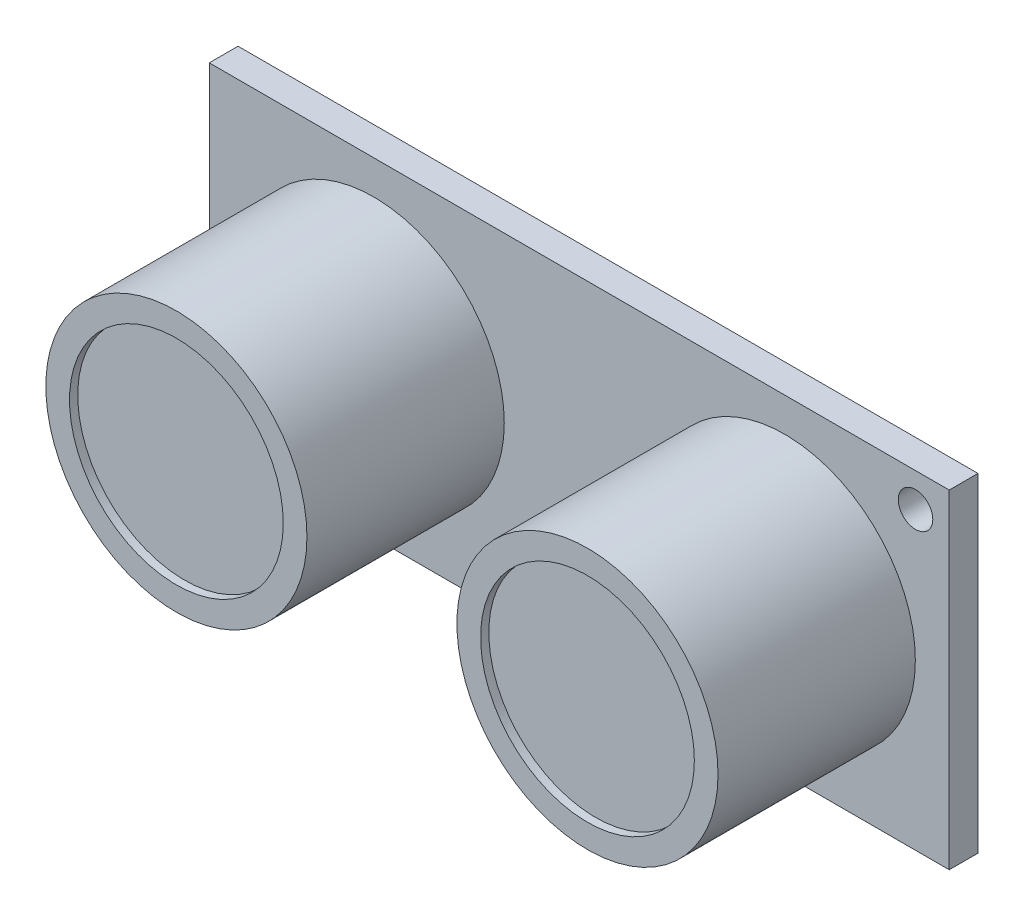
ISO-10303-21;
HEADER;
FILE_DESCRIPTION(('STEP AP214'),'2;1');
FILE_NAME('part.step','',(''),(''),'','','');
FILE_SCHEMA(('AUTOMOTIVE_DESIGN { 1 0 10303 214 1 1 1 1 }'));
ENDSEC;
DATA;
#1=APPLICATION_CONTEXT('core data for automotive mechanical design processes');
#2=APPLICATION_PROTOCOL_DEFINITION('international standard','automotive_design',2000,#1);
#3=PRODUCT_CONTEXT('',#1,'mechanical');
#4=PRODUCT('Part','Part','',(#3));
#5=PRODUCT_RELATED_PRODUCT_CATEGORY('part','',(#4));
#6=PRODUCT_DEFINITION_FORMATION('','',#4);
#7=PRODUCT_DEFINITION_CONTEXT('part definition',#1,'design');
#8=PRODUCT_DEFINITION('design','',#6,#7);
#9=PRODUCT_DEFINITION_SHAPE('','',#8);
#10=(LENGTH_UNIT() NAMED_UNIT(*) SI_UNIT(.MILLI.,.METRE.));
#11=(NAMED_UNIT(*) PLANE_ANGLE_UNIT() SI_UNIT($,.RADIAN.));
#12=(NAMED_UNIT(*) SI_UNIT($,.STERADIAN.) SOLID_ANGLE_UNIT());
#13=UNCERTAINTY_MEASURE_WITH_UNIT(LENGTH_MEASURE(1.E-05),#10,'distance_accuracy_value','');
#14=(GEOMETRIC_REPRESENTATION_CONTEXT(3) GLOBAL_UNCERTAINTY_ASSIGNED_CONTEXT((#13)) GLOBAL_UNIT_ASSIGNED_CONTEXT((#10,
#11,#12)) REPRESENTATION_CONTEXT('',''));
#15=CARTESIAN_POINT('',(0.,0.,0.));
#16=DIRECTION('',(0.,0.,1.));
#17=DIRECTION('',(1.,0.,0.));
#18=AXIS2_PLACEMENT_3D('',#15,#16,#17);
#19=CARTESIAN_POINT('',(0.,0.,0.));
#20=DIRECTION('',(0.,0.,1.));
#21=DIRECTION('',(1.,0.,0.));
#22=AXIS2_PLACEMENT_3D('',#19,#20,#21);
#23=PLANE('',#22);
#24=CARTESIAN_POINT('',(-17.6564034730701,23.4240062406729,0.));
#25=DIRECTION('',(0.,0.,1.));
#26=DIRECTION('',(1.,0.,0.));
#27=AXIS2_PLACEMENT_3D('',#24,#25,#26);
#28=CIRCLE('',#27,1.05);
#29=CARTESIAN_POINT('',(-16.6064034730701,23.4240062406729,0.));
#30=VERTEX_POINT('',#29);
#31=EDGE_CURVE('E198',#30,#30,#28,.T.);
#32=ORIENTED_EDGE('',*,*,#31,.T.);
#33=EDGE_LOOP('',(#32));
#34=FACE_BOUND('',#33,.T.);
#35=DIRECTION('',(0.,-1.,0.));
#36=VECTOR('',#35,1.);
#37=CARTESIAN_POINT('',(-60.6064034730701,25.4740062406729,0.));
#38=LINE('',#37,#36);
#39=CARTESIAN_POINT('',(-60.6064034730701,25.4740062406729,0.));
#40=VERTEX_POINT('',#39);
#41=CARTESIAN_POINT('',(-60.6064034730701,5.47400624067289,0.));
#42=VERTEX_POINT('',#41);
#43=EDGE_CURVE('E210',#40,#42,#38,.T.);
#44=ORIENTED_EDGE('',*,*,#43,.F.);
#45=DIRECTION('',(-1.,0.,0.));
#46=VECTOR('',#45,1.);
#47=CARTESIAN_POINT('',(-60.6064034730701,25.4740062406729,0.));
#48=LINE('',#47,#46);
#49=CARTESIAN_POINT('',(-15.6064034730701,25.4740062406729,0.));
#50=VERTEX_POINT('',#49);
#51=EDGE_CURVE('E217',#50,#40,#48,.T.);
#52=ORIENTED_EDGE('',*,*,#51,.F.);
#53=DIRECTION('',(0.,1.,0.));
#54=VECTOR('',#53,1.);
#55=CARTESIAN_POINT('',(-15.6064034730701,25.4740062406729,0.));
#56=LINE('',#55,#54);
#57=CARTESIAN_POINT('',(-15.6064034730701,5.47400624067289,0.));
#58=VERTEX_POINT('',#57);
#59=EDGE_CURVE('E228',#58,#50,#56,.T.);
#60=ORIENTED_EDGE('',*,*,#59,.F.);
#61=DIRECTION('',(1.,0.,0.));
#62=VECTOR('',#61,1.);
#63=CARTESIAN_POINT('',(-60.6064034730701,5.47400624067289,0.));
#64=LINE('',#63,#62);
#65=EDGE_CURVE('E226',#42,#58,#64,.T.);
#66=ORIENTED_EDGE('',*,*,#65,.F.);
#67=EDGE_LOOP('',(#44,#52,#60,#66));
#68=FACE_BOUND('',#67,.T.);
#69=CARTESIAN_POINT('',(-58.5564034730701,7.52400624067289,0.));
#70=DIRECTION('',(0.,0.,1.));
#71=DIRECTION('',(1.,0.,0.));
#72=AXIS2_PLACEMENT_3D('',#69,#70,#71);
#73=CIRCLE('',#72,1.05);
#74=CARTESIAN_POINT('',(-57.5064034730701,7.52400624067289,0.));
#75=VERTEX_POINT('',#74);
#76=EDGE_CURVE('E204',#75,#75,#73,.T.);
#77=ORIENTED_EDGE('',*,*,#76,.T.);
#78=EDGE_LOOP('',(#77));
#79=FACE_BOUND('',#78,.T.);
#80=DIRECTION('',(0.,-1.,0.));
#81=VECTOR('',#80,1.);
#82=CARTESIAN_POINT('',(-32.8933036925584,8.69490428219888,0.));
#83=LINE('',#82,#81);
#84=CARTESIAN_POINT('',(-32.8933036925584,8.69490428219888,0.));
#85=VERTEX_POINT('',#84);
#86=CARTESIAN_POINT('',(-32.8933036925584,5.87354584212114,0.));
#87=VERTEX_POINT('',#86);
#88=EDGE_CURVE('E124',#85,#87,#83,.T.);
#89=ORIENTED_EDGE('',*,*,#88,.F.);
#90=DIRECTION('',(1.,0.,0.));
#91=VECTOR('',#90,1.);
#92=CARTESIAN_POINT('',(-32.8933036925584,8.69490428219888,0.));
#93=LINE('',#92,#91);
#94=CARTESIAN_POINT('',(-42.7535151480879,8.69490428219888,0.));
#95=VERTEX_POINT('',#94);
#96=EDGE_CURVE('E121',#95,#85,#93,.T.);
#97=ORIENTED_EDGE('',*,*,#96,.F.);
#98=DIRECTION('',(0.,1.,0.));
#99=VECTOR('',#98,1.);
#100=CARTESIAN_POINT('',(-42.7535151480879,8.69490428219888,0.));
#101=LINE('',#100,#99);
#102=CARTESIAN_POINT('',(-42.7535151480879,5.87354584212114,0.));
#103=VERTEX_POINT('',#102);
#104=EDGE_CURVE('E58',#103,#95,#101,.T.);
#105=ORIENTED_EDGE('',*,*,#104,.F.);
#106=DIRECTION('',(-1.,0.,0.));
#107=VECTOR('',#106,1.);
#108=CARTESIAN_POINT('',(-32.8933036925584,5.87354584212114,0.));
#109=LINE('',#108,#107);
#110=EDGE_CURVE('E53',#87,#103,#109,.T.);
#111=ORIENTED_EDGE('',*,*,#110,.F.);
#112=EDGE_LOOP('',(#89,#97,#105,#111));
#113=FACE_BOUND('',#112,.T.);
#114=ADVANCED_FACE('F37',(#34,#68,#79,#113),#23,.F.);
#115=CARTESIAN_POINT('',(0.,0.,1.75));
#116=DIRECTION('',(0.,0.,1.));
#117=DIRECTION('',(1.,0.,0.));
#118=AXIS2_PLACEMENT_3D('',#115,#116,#117);
#119=PLANE('',#118);
#120=CARTESIAN_POINT('',(-36.5664034730701,7.37400624067289,1.75));
#121=DIRECTION('',(0.,0.,1.));
#122=DIRECTION('',(1.,0.,0.));
#123=AXIS2_PLACEMENT_3D('',#120,#121,#122);
#124=CIRCLE('',#123,0.320000000000004);
#125=CARTESIAN_POINT('',(-36.2464034730701,7.37400624067289,1.75));
#126=VERTEX_POINT('',#125);
#127=EDGE_CURVE('E155',#126,#126,#124,.F.);
#128=ORIENTED_EDGE('',*,*,#127,.T.);
#129=EDGE_LOOP('',(#128));
#130=FACE_BOUND('',#129,.T.);
#131=CARTESIAN_POINT('',(-41.6464034730701,7.37400624067289,1.75));
#132=DIRECTION('',(0.,0.,1.));
#133=DIRECTION('',(1.,0.,0.));
#134=AXIS2_PLACEMENT_3D('',#131,#132,#133);
#135=CIRCLE('',#134,0.320000000000004);
#136=CARTESIAN_POINT('',(-41.3264034730701,7.37400624067289,1.75));
#137=VERTEX_POINT('',#136);
#138=EDGE_CURVE('E173',#137,#137,#135,.F.);
#139=ORIENTED_EDGE('',*,*,#138,.T.);
#140=EDGE_LOOP('',(#139));
#141=FACE_BOUND('',#140,.T.);
#142=CARTESIAN_POINT('',(-50.6064034730701,15.4740062406729,1.75));
#143=DIRECTION('',(0.,0.,1.));
#144=DIRECTION('',(1.,0.,0.));
#145=AXIS2_PLACEMENT_3D('',#142,#143,#144);
#146=CIRCLE('',#145,7.94);
#147=CARTESIAN_POINT('',(-42.6664034730701,15.4740062406729,1.75));
#148=VERTEX_POINT('',#147);
#149=EDGE_CURVE('E192',#148,#148,#146,.T.);
#150=ORIENTED_EDGE('',*,*,#149,.F.);
#151=EDGE_LOOP('',(#150));
#152=FACE_BOUND('',#151,.T.);
#153=CARTESIAN_POINT('',(-58.5564034730701,7.52400624067289,1.75));
#154=DIRECTION('',(0.,0.,1.));
#155=DIRECTION('',(1.,0.,0.));
#156=AXIS2_PLACEMENT_3D('',#153,#154,#155);
#157=CIRCLE('',#156,1.05);
#158=CARTESIAN_POINT('',(-57.5064034730701,7.52400624067289,1.75));
#159=VERTEX_POINT('',#158);
#160=EDGE_CURVE('E207',#159,#159,#157,.T.);
#161=ORIENTED_EDGE('',*,*,#160,.F.);
#162=EDGE_LOOP('',(#161));
#163=FACE_BOUND('',#162,.T.);
#164=DIRECTION('',(0.,-1.,0.));
#165=VECTOR('',#164,1.);
#166=CARTESIAN_POINT('',(-60.6064034730701,25.4740062406729,1.75));
#167=LINE('',#166,#165);
#168=CARTESIAN_POINT('',(-60.6064034730701,25.4740062406729,1.75));
#169=VERTEX_POINT('',#168);
#170=CARTESIAN_POINT('',(-60.6064034730701,5.47400624067289,1.75));
#171=VERTEX_POINT('',#170);
#172=EDGE_CURVE('E213',#169,#171,#167,.T.);
#173=ORIENTED_EDGE('',*,*,#172,.T.);
#174=DIRECTION('',(1.,0.,0.));
#175=VECTOR('',#174,1.);
#176=CARTESIAN_POINT('',(-60.6064034730701,5.47400624067289,1.75));
#177=LINE('',#176,#175);
#178=CARTESIAN_POINT('',(-15.6064034730701,5.47400624067289,1.75));
#179=VERTEX_POINT('',#178);
#180=EDGE_CURVE('E216',#171,#179,#177,.T.);
#181=ORIENTED_EDGE('',*,*,#180,.T.);
#182=DIRECTION('',(0.,1.,0.));
#183=VECTOR('',#182,1.);
#184=CARTESIAN_POINT('',(-15.6064034730701,25.4740062406729,1.75));
#185=LINE('',#184,#183);
#186=CARTESIAN_POINT('',(-15.6064034730701,25.4740062406729,1.75));
#187=VERTEX_POINT('',#186);
#188=EDGE_CURVE('E219',#179,#187,#185,.T.);
#189=ORIENTED_EDGE('',*,*,#188,.T.);
#190=DIRECTION('',(-1.,0.,0.));
#191=VECTOR('',#190,1.);
#192=CARTESIAN_POINT('',(-60.6064034730701,25.4740062406729,1.75));
#193=LINE('',#192,#191);
#194=EDGE_CURVE('E221',#187,#169,#193,.T.);
#195=ORIENTED_EDGE('',*,*,#194,.T.);
#196=EDGE_LOOP('',(#173,#181,#189,#195));
#197=FACE_BOUND('',#196,.T.);
#198=CARTESIAN_POINT('',(-17.6564034730701,23.4240062406729,1.75));
#199=DIRECTION('',(0.,0.,1.));
#200=DIRECTION('',(1.,0.,0.));
#201=AXIS2_PLACEMENT_3D('',#198,#199,#200);
#202=CIRCLE('',#201,1.05);
#203=CARTESIAN_POINT('',(-16.6064034730701,23.4240062406729,1.75));
#204=VERTEX_POINT('',#203);
#205=EDGE_CURVE('E201',#204,#204,#202,.T.);
#206=ORIENTED_EDGE('',*,*,#205,.F.);
#207=EDGE_LOOP('',(#206));
#208=FACE_BOUND('',#207,.T.);
#209=CARTESIAN_POINT('',(-25.6064034730701,15.4740062406729,1.75));
#210=DIRECTION('',(0.,0.,1.));
#211=DIRECTION('',(1.,0.,0.));
#212=AXIS2_PLACEMENT_3D('',#209,#210,#211);
#213=CIRCLE('',#212,7.94);
#214=CARTESIAN_POINT('',(-17.6664034730701,15.4740062406729,1.75));
#215=VERTEX_POINT('',#214);
#216=EDGE_CURVE('E186',#215,#215,#213,.T.);
#217=ORIENTED_EDGE('',*,*,#216,.F.);
#218=EDGE_LOOP('',(#217));
#219=FACE_BOUND('',#218,.T.);
#220=CARTESIAN_POINT('',(-39.1064034730701,7.37400624067289,1.75));
#221=DIRECTION('',(0.,0.,1.));
#222=DIRECTION('',(1.,0.,0.));
#223=AXIS2_PLACEMENT_3D('',#220,#221,#222);
#224=CIRCLE('',#223,0.320000000000004);
#225=CARTESIAN_POINT('',(-38.7864034730701,7.37400624067289,1.75));
#226=VERTEX_POINT('',#225);
#227=EDGE_CURVE('E164',#226,#226,#224,.F.);
#228=ORIENTED_EDGE('',*,*,#227,.T.);
#229=EDGE_LOOP('',(#228));
#230=FACE_BOUND('',#229,.T.);
#231=CARTESIAN_POINT('',(-34.0264034730701,7.37400624067289,1.75));
#232=DIRECTION('',(0.,0.,1.));
#233=DIRECTION('',(1.,0.,0.));
#234=AXIS2_PLACEMENT_3D('',#231,#232,#233);
#235=CIRCLE('',#234,0.320000000000004);
#236=CARTESIAN_POINT('',(-33.7064034730701,7.37400624067289,1.75));
#237=VERTEX_POINT('',#236);
#238=EDGE_CURVE('E146',#237,#237,#235,.F.);
#239=ORIENTED_EDGE('',*,*,#238,.T.);
#240=EDGE_LOOP('',(#239));
#241=FACE_BOUND('',#240,.T.);
#242=ADVANCED_FACE('F280',(#130,#141,#152,#163,#197,#208,#219,#230,#241),#119,.T.);
#243=CARTESIAN_POINT('',(-60.6064034730701,25.4740062406729,1.75));
#244=DIRECTION('',(1.,0.,0.));
#245=DIRECTION('',(0.,0.,-1.));
#246=AXIS2_PLACEMENT_3D('',#243,#244,#245);
#247=PLANE('',#246);
#248=ORIENTED_EDGE('',*,*,#43,.T.);
#249=DIRECTION('',(0.,0.,-1.));
#250=VECTOR('',#249,1.);
#251=CARTESIAN_POINT('',(-60.6064034730701,5.47400624067289,1.75));
#252=LINE('',#251,#250);
#253=EDGE_CURVE('E239',#171,#42,#252,.T.);
#254=ORIENTED_EDGE('',*,*,#253,.F.);
#255=ORIENTED_EDGE('',*,*,#172,.F.);
#256=DIRECTION('',(0.,0.,-1.));
#257=VECTOR('',#256,1.);
#258=CARTESIAN_POINT('',(-60.6064034730701,25.4740062406729,1.75));
#259=LINE('',#258,#257);
#260=EDGE_CURVE('E223',#169,#40,#259,.T.);
#261=ORIENTED_EDGE('',*,*,#260,.T.);
#262=EDGE_LOOP('',(#248,#254,#255,#261));
#263=FACE_BOUND('',#262,.T.);
#264=ADVANCED_FACE('F286',(#263),#247,.F.);
#265=CARTESIAN_POINT('',(-60.6064034730701,5.47400624067289,1.75));
#266=DIRECTION('',(0.,1.,0.));
#267=DIRECTION('',(0.,0.,1.));
#268=AXIS2_PLACEMENT_3D('',#265,#266,#267);
#269=PLANE('',#268);
#270=ORIENTED_EDGE('',*,*,#65,.T.);
#271=DIRECTION('',(0.,0.,-1.));
#272=VECTOR('',#271,1.);
#273=CARTESIAN_POINT('',(-15.6064034730701,5.47400624067289,1.75));
#274=LINE('',#273,#272);
#275=EDGE_CURVE('E236',#179,#58,#274,.T.);
#276=ORIENTED_EDGE('',*,*,#275,.F.);
#277=ORIENTED_EDGE('',*,*,#180,.F.);
#278=ORIENTED_EDGE('',*,*,#253,.T.);
#279=EDGE_LOOP('',(#270,#276,#277,#278));
#280=FACE_BOUND('',#279,.T.);
#281=ADVANCED_FACE('F300',(#280),#269,.F.);
#282=CARTESIAN_POINT('',(-15.6064034730701,25.4740062406729,1.75));
#283=DIRECTION('',(-1.,0.,0.));
#284=DIRECTION('',(0.,0.,1.));
#285=AXIS2_PLACEMENT_3D('',#282,#283,#284);
#286=PLANE('',#285);
#287=ORIENTED_EDGE('',*,*,#59,.T.);
#288=DIRECTION('',(0.,0.,-1.));
#289=VECTOR('',#288,1.);
#290=CARTESIAN_POINT('',(-15.6064034730701,25.4740062406729,1.75));
#291=LINE('',#290,#289);
#292=EDGE_CURVE('E233',#187,#50,#291,.T.);
#293=ORIENTED_EDGE('',*,*,#292,.F.);
#294=ORIENTED_EDGE('',*,*,#188,.F.);
#295=ORIENTED_EDGE('',*,*,#275,.T.);
#296=EDGE_LOOP('',(#287,#293,#294,#295));
#297=FACE_BOUND('',#296,.T.);
#298=ADVANCED_FACE('F296',(#297),#286,.F.);
#299=CARTESIAN_POINT('',(-60.6064034730701,25.4740062406729,1.75));
#300=DIRECTION('',(0.,-1.,0.));
#301=DIRECTION('',(0.,0.,-1.));
#302=AXIS2_PLACEMENT_3D('',#299,#300,#301);
#303=PLANE('',#302);
#304=ORIENTED_EDGE('',*,*,#51,.T.);
#305=ORIENTED_EDGE('',*,*,#260,.F.);
#306=ORIENTED_EDGE('',*,*,#194,.F.);
#307=ORIENTED_EDGE('',*,*,#292,.T.);
#308=EDGE_LOOP('',(#304,#305,#306,#307));
#309=FACE_BOUND('',#308,.T.);
#310=ADVANCED_FACE('F292',(#309),#303,.F.);
#311=CARTESIAN_POINT('',(-58.5564034730701,7.52400624067289,1.75));
#312=DIRECTION('',(0.,0.,-1.));
#313=DIRECTION('',(-1.,0.,0.));
#314=AXIS2_PLACEMENT_3D('',#311,#312,#313);
#315=CYLINDRICAL_SURFACE('',#314,1.05);
#316=ORIENTED_EDGE('',*,*,#160,.T.);
#317=EDGE_LOOP('',(#316));
#318=FACE_BOUND('',#317,.T.);
#319=ORIENTED_EDGE('',*,*,#76,.F.);
#320=EDGE_LOOP('',(#319));
#321=FACE_BOUND('',#320,.T.);
#322=ADVANCED_FACE('F295',(#318,#321),#315,.F.);
#323=CARTESIAN_POINT('',(-17.6564034730701,23.4240062406729,1.75));
#324=DIRECTION('',(0.,0.,-1.));
#325=DIRECTION('',(-1.,0.,0.));
#326=AXIS2_PLACEMENT_3D('',#323,#324,#325);
#327=CYLINDRICAL_SURFACE('',#326,1.05);
#328=ORIENTED_EDGE('',*,*,#205,.T.);
#329=EDGE_LOOP('',(#328));
#330=FACE_BOUND('',#329,.T.);
#331=ORIENTED_EDGE('',*,*,#31,.F.);
#332=EDGE_LOOP('',(#331));
#333=FACE_BOUND('',#332,.T.);
#334=ADVANCED_FACE('F412',(#330,#333),#327,.F.);
#335=CARTESIAN_POINT('',(-50.6064034730701,15.4740062406729,13.75));
#336=DIRECTION('',(0.,0.,-1.));
#337=DIRECTION('',(-1.,0.,0.));
#338=AXIS2_PLACEMENT_3D('',#335,#336,#337);
#339=CYLINDRICAL_SURFACE('',#338,7.94);
#340=CARTESIAN_POINT('',(-50.6064034730701,15.4740062406729,13.75));
#341=DIRECTION('',(0.,0.,1.));
#342=DIRECTION('',(1.,0.,0.));
#343=AXIS2_PLACEMENT_3D('',#340,#341,#342);
#344=CIRCLE('',#343,7.94);
#345=CARTESIAN_POINT('',(-42.6664034730701,15.4740062406729,13.75));
#346=VERTEX_POINT('',#345);
#347=EDGE_CURVE('E195',#346,#346,#344,.T.);
#348=ORIENTED_EDGE('',*,*,#347,.F.);
#349=EDGE_LOOP('',(#348));
#350=FACE_BOUND('',#349,.T.);
#351=ORIENTED_EDGE('',*,*,#149,.T.);
#352=EDGE_LOOP('',(#351));
#353=FACE_BOUND('',#352,.T.);
#354=ADVANCED_FACE('F404',(#350,#353),#339,.T.);
#355=CARTESIAN_POINT('',(-50.6064034730701,15.4740062406729,13.75));
#356=DIRECTION('',(0.,0.,1.));
#357=DIRECTION('',(1.,0.,0.));
#358=AXIS2_PLACEMENT_3D('',#355,#356,#357);
#359=PLANE('',#358);
#360=CARTESIAN_POINT('',(-50.6064034730701,15.4740062406729,13.75));
#361=DIRECTION('',(0.,0.,1.));
#362=DIRECTION('',(1.,0.,0.));
#363=AXIS2_PLACEMENT_3D('',#360,#361,#362);
#364=CIRCLE('',#363,6.5);
#365=CARTESIAN_POINT('',(-44.1064034730701,15.4740062406729,13.75));
#366=VERTEX_POINT('',#365);
#367=EDGE_CURVE('E180',#366,#366,#364,.T.);
#368=ORIENTED_EDGE('',*,*,#367,.F.);
#369=EDGE_LOOP('',(#368));
#370=FACE_BOUND('',#369,.T.);
#371=ORIENTED_EDGE('',*,*,#347,.T.);
#372=EDGE_LOOP('',(#371));
#373=FACE_BOUND('',#372,.T.);
#374=ADVANCED_FACE('F394',(#370,#373),#359,.T.);
#375=CARTESIAN_POINT('',(-25.6064034730701,15.4740062406729,13.75));
#376=DIRECTION('',(0.,0.,-1.));
#377=DIRECTION('',(-1.,0.,0.));
#378=AXIS2_PLACEMENT_3D('',#375,#376,#377);
#379=CYLINDRICAL_SURFACE('',#378,7.94);
#380=CARTESIAN_POINT('',(-25.6064034730701,15.4740062406729,13.75));
#381=DIRECTION('',(0.,0.,1.));
#382=DIRECTION('',(1.,0.,0.));
#383=AXIS2_PLACEMENT_3D('',#380,#381,#382);
#384=CIRCLE('',#383,7.94);
#385=CARTESIAN_POINT('',(-17.6664034730701,15.4740062406729,13.75));
#386=VERTEX_POINT('',#385);
#387=EDGE_CURVE('E189',#386,#386,#384,.T.);
#388=ORIENTED_EDGE('',*,*,#387,.F.);
#389=EDGE_LOOP('',(#388));
#390=FACE_BOUND('',#389,.T.);
#391=ORIENTED_EDGE('',*,*,#216,.T.);
#392=EDGE_LOOP('',(#391));
#393=FACE_BOUND('',#392,.T.);
#394=ADVANCED_FACE('F391',(#390,#393),#379,.T.);
#395=CARTESIAN_POINT('',(-25.6064034730701,15.4740062406729,13.75));
#396=DIRECTION('',(0.,0.,1.));
#397=DIRECTION('',(1.,0.,0.));
#398=AXIS2_PLACEMENT_3D('',#395,#396,#397);
#399=PLANE('',#398);
#400=CARTESIAN_POINT('',(-25.6064034730701,15.4740062406729,13.75));
#401=DIRECTION('',(0.,0.,1.));
#402=DIRECTION('',(1.,0.,0.));
#403=AXIS2_PLACEMENT_3D('',#400,#401,#402);
#404=CIRCLE('',#403,6.5);
#405=CARTESIAN_POINT('',(-19.1064034730701,15.4740062406729,13.75));
#406=VERTEX_POINT('',#405);
#407=EDGE_CURVE('E176',#406,#406,#404,.T.);
#408=ORIENTED_EDGE('',*,*,#407,.F.);
#409=EDGE_LOOP('',(#408));
#410=FACE_BOUND('',#409,.T.);
#411=ORIENTED_EDGE('',*,*,#387,.T.);
#412=EDGE_LOOP('',(#411));
#413=FACE_BOUND('',#412,.T.);
#414=ADVANCED_FACE('F393',(#410,#413),#399,.T.);
#415=CARTESIAN_POINT('',(-50.6064034730701,15.4740062406729,13.25));
#416=DIRECTION('',(0.,0.,1.));
#417=DIRECTION('',(1.,0.,0.));
#418=AXIS2_PLACEMENT_3D('',#415,#416,#417);
#419=CYLINDRICAL_SURFACE('',#418,6.5);
#420=CARTESIAN_POINT('',(-50.6064034730701,15.4740062406729,13.25));
#421=DIRECTION('',(0.,0.,1.));
#422=DIRECTION('',(1.,0.,0.));
#423=AXIS2_PLACEMENT_3D('',#420,#421,#422);
#424=CIRCLE('',#423,6.5);
#425=CARTESIAN_POINT('',(-44.1064034730701,15.4740062406729,13.25));
#426=VERTEX_POINT('',#425);
#427=EDGE_CURVE('E183',#426,#426,#424,.T.);
#428=ORIENTED_EDGE('',*,*,#427,.F.);
#429=EDGE_LOOP('',(#428));
#430=FACE_BOUND('',#429,.T.);
#431=ORIENTED_EDGE('',*,*,#367,.T.);
#432=EDGE_LOOP('',(#431));
#433=FACE_BOUND('',#432,.T.);
#434=ADVANCED_FACE('F401',(#430,#433),#419,.F.);
#435=CARTESIAN_POINT('',(-50.6064034730701,15.4740062406729,13.25));
#436=DIRECTION('',(0.,0.,1.));
#437=DIRECTION('',(1.,0.,0.));
#438=AXIS2_PLACEMENT_3D('',#435,#436,#437);
#439=PLANE('',#438);
#440=ORIENTED_EDGE('',*,*,#427,.T.);
#441=EDGE_LOOP('',(#440));
#442=FACE_BOUND('',#441,.T.);
#443=ADVANCED_FACE('F719',(#442),#439,.T.);
#444=CARTESIAN_POINT('',(-25.6064034730701,15.4740062406729,13.25));
#445=DIRECTION('',(0.,0.,1.));
#446=DIRECTION('',(1.,0.,0.));
#447=AXIS2_PLACEMENT_3D('',#444,#445,#446);
#448=CYLINDRICAL_SURFACE('',#447,6.5);
#449=CARTESIAN_POINT('',(-25.6064034730701,15.4740062406729,13.25));
#450=DIRECTION('',(0.,0.,1.));
#451=DIRECTION('',(1.,0.,0.));
#452=AXIS2_PLACEMENT_3D('',#449,#450,#451);
#453=CIRCLE('',#452,6.5);
#454=CARTESIAN_POINT('',(-19.1064034730701,15.4740062406729,13.25));
#455=VERTEX_POINT('',#454);
#456=EDGE_CURVE('E177',#455,#455,#453,.T.);
#457=ORIENTED_EDGE('',*,*,#456,.F.);
#458=EDGE_LOOP('',(#457));
#459=FACE_BOUND('',#458,.T.);
#460=ORIENTED_EDGE('',*,*,#407,.T.);
#461=EDGE_LOOP('',(#460));
#462=FACE_BOUND('',#461,.T.);
#463=ADVANCED_FACE('F714',(#459,#462),#448,.F.);
#464=CARTESIAN_POINT('',(-25.6064034730701,15.4740062406729,13.25));
#465=DIRECTION('',(0.,0.,1.));
#466=DIRECTION('',(1.,0.,0.));
#467=AXIS2_PLACEMENT_3D('',#464,#465,#466);
#468=PLANE('',#467);
#469=ORIENTED_EDGE('',*,*,#456,.T.);
#470=EDGE_LOOP('',(#469));
#471=FACE_BOUND('',#470,.T.);
#472=ADVANCED_FACE('F589',(#471),#468,.T.);
#473=CARTESIAN_POINT('',(-41.6464034730701,7.37400624067289,-3.06999999999999));
#474=DIRECTION('',(0.,0.,1.));
#475=DIRECTION('',(0.,-1.,0.));
#476=AXIS2_PLACEMENT_3D('',#473,#474,#475);
#477=CYLINDRICAL_SURFACE('',#476,0.320000000000004);
#478=CARTESIAN_POINT('',(-41.6464034730701,7.37400624067289,3.18));
#479=DIRECTION('',(0.,0.,1.));
#480=DIRECTION('',(0.,-1.,0.));
#481=AXIS2_PLACEMENT_3D('',#478,#479,#480);
#482=CIRCLE('',#481,0.320000000000004);
#483=CARTESIAN_POINT('',(-41.6464034730701,7.05400624067289,3.18));
#484=VERTEX_POINT('',#483);
#485=EDGE_CURVE('E242',#484,#484,#482,.F.);
#486=ORIENTED_EDGE('',*,*,#485,.T.);
#487=EDGE_LOOP('',(#486));
#488=FACE_BOUND('',#487,.T.);
#489=ORIENTED_EDGE('',*,*,#138,.F.);
#490=EDGE_LOOP('',(#489));
#491=FACE_BOUND('',#490,.T.);
#492=ADVANCED_FACE('F312',(#488,#491),#477,.T.);
#493=CARTESIAN_POINT('',(-41.6464034730701,7.37400624067289,3.18));
#494=DIRECTION('',(0.,0.,1.));
#495=DIRECTION('',(1.,0.,0.));
#496=AXIS2_PLACEMENT_3D('',#493,#494,#495);
#497=SPHERICAL_SURFACE('',#496,0.32);
#498=ORIENTED_EDGE('',*,*,#485,.F.);
#499=EDGE_LOOP('',(#498));
#500=FACE_BOUND('',#499,.T.);
#501=ADVANCED_FACE('F308',(#500),#497,.T.);
#502=CARTESIAN_POINT('',(-39.1064034730701,7.37400624067289,-3.06999999999999));
#503=DIRECTION('',(0.,0.,1.));
#504=DIRECTION('',(0.,-1.,0.));
#505=AXIS2_PLACEMENT_3D('',#502,#503,#504);
#506=CYLINDRICAL_SURFACE('',#505,0.320000000000004);
#507=CARTESIAN_POINT('',(-39.1064034730701,7.37400624067289,3.18));
#508=DIRECTION('',(0.,0.,1.));
#509=DIRECTION('',(0.,-1.,0.));
#510=AXIS2_PLACEMENT_3D('',#507,#508,#509);
#511=CIRCLE('',#510,0.320000000000004);
#512=CARTESIAN_POINT('',(-39.1064034730701,7.05400624067289,3.18));
#513=VERTEX_POINT('',#512);
#514=EDGE_CURVE('E248',#513,#513,#511,.F.);
#515=ORIENTED_EDGE('',*,*,#514,.T.);
#516=EDGE_LOOP('',(#515));
#517=FACE_BOUND('',#516,.T.);
#518=ORIENTED_EDGE('',*,*,#227,.F.);
#519=EDGE_LOOP('',(#518));
#520=FACE_BOUND('',#519,.T.);
#521=ADVANCED_FACE('F311',(#517,#520),#506,.T.);
#522=CARTESIAN_POINT('',(-36.5664034730701,7.37400624067289,-3.06999999999999));
#523=DIRECTION('',(0.,0.,1.));
#524=DIRECTION('',(0.,-1.,0.));
#525=AXIS2_PLACEMENT_3D('',#522,#523,#524);
#526=CYLINDRICAL_SURFACE('',#525,0.320000000000004);
#527=CARTESIAN_POINT('',(-36.5664034730701,7.37400624067289,3.18));
#528=DIRECTION('',(0.,0.,1.));
#529=DIRECTION('',(0.,-1.,0.));
#530=AXIS2_PLACEMENT_3D('',#527,#528,#529);
#531=CIRCLE('',#530,0.320000000000004);
#532=CARTESIAN_POINT('',(-36.5664034730701,7.05400624067289,3.18));
#533=VERTEX_POINT('',#532);
#534=EDGE_CURVE('E254',#533,#533,#531,.F.);
#535=ORIENTED_EDGE('',*,*,#534,.T.);
#536=EDGE_LOOP('',(#535));
#537=FACE_BOUND('',#536,.T.);
#538=ORIENTED_EDGE('',*,*,#127,.F.);
#539=EDGE_LOOP('',(#538));
#540=FACE_BOUND('',#539,.T.);
#541=ADVANCED_FACE('F355',(#537,#540),#526,.T.);
#542=CARTESIAN_POINT('',(-34.0264034730701,7.37400624067289,-3.06999999999999));
#543=DIRECTION('',(0.,0.,1.));
#544=DIRECTION('',(0.,-1.,0.));
#545=AXIS2_PLACEMENT_3D('',#542,#543,#544);
#546=CYLINDRICAL_SURFACE('',#545,0.320000000000004);
#547=CARTESIAN_POINT('',(-34.0264034730701,7.37400624067289,3.18));
#548=DIRECTION('',(0.,0.,1.));
#549=DIRECTION('',(0.,-1.,0.));
#550=AXIS2_PLACEMENT_3D('',#547,#548,#549);
#551=CIRCLE('',#550,0.320000000000004);
#552=CARTESIAN_POINT('',(-34.0264034730701,7.05400624067289,3.18));
#553=VERTEX_POINT('',#552);
#554=EDGE_CURVE('E46',#553,#553,#551,.F.);
#555=ORIENTED_EDGE('',*,*,#554,.T.);
#556=EDGE_LOOP('',(#555));
#557=FACE_BOUND('',#556,.T.);
#558=ORIENTED_EDGE('',*,*,#238,.F.);
#559=EDGE_LOOP('',(#558));
#560=FACE_BOUND('',#559,.T.);
#561=ADVANCED_FACE('F263',(#557,#560),#546,.T.);
#562=CARTESIAN_POINT('',(-39.1064034730701,7.37400624067289,3.18));
#563=DIRECTION('',(0.,0.,1.));
#564=DIRECTION('',(1.,0.,0.));
#565=AXIS2_PLACEMENT_3D('',#562,#563,#564);
#566=SPHERICAL_SURFACE('',#565,0.32);
#567=ORIENTED_EDGE('',*,*,#514,.F.);
#568=EDGE_LOOP('',(#567));
#569=FACE_BOUND('',#568,.T.);
#570=ADVANCED_FACE('F275',(#569),#566,.T.);
#571=CARTESIAN_POINT('',(-36.5664034730701,7.37400624067289,3.18));
#572=DIRECTION('',(0.,0.,1.));
#573=DIRECTION('',(1.,0.,0.));
#574=AXIS2_PLACEMENT_3D('',#571,#572,#573);
#575=SPHERICAL_SURFACE('',#574,0.32);
#576=ORIENTED_EDGE('',*,*,#534,.F.);
#577=EDGE_LOOP('',(#576));
#578=FACE_BOUND('',#577,.T.);
#579=ADVANCED_FACE('F268',(#578),#575,.T.);
#580=CARTESIAN_POINT('',(-34.0264034730701,7.37400624067289,3.18));
#581=DIRECTION('',(0.,0.,1.));
#582=DIRECTION('',(1.,0.,0.));
#583=AXIS2_PLACEMENT_3D('',#580,#581,#582);
#584=SPHERICAL_SURFACE('',#583,0.32);
#585=ORIENTED_EDGE('',*,*,#554,.F.);
#586=EDGE_LOOP('',(#585));
#587=FACE_BOUND('',#586,.T.);
#588=ADVANCED_FACE('F266',(#587),#584,.T.);
#589=CARTESIAN_POINT('',(0.,0.,-2.));
#590=DIRECTION('',(0.,0.,-1.));
#591=DIRECTION('',(-1.,0.,0.));
#592=AXIS2_PLACEMENT_3D('',#589,#590,#591);
#593=PLANE('',#592);
#594=CARTESIAN_POINT('',(-39.1064034730701,7.37400624067289,-2.));
#595=DIRECTION('',(0.,0.,-1.));
#596=DIRECTION('',(-1.,0.,0.));
#597=AXIS2_PLACEMENT_3D('',#594,#595,#596);
#598=CIRCLE('',#597,0.320000000000004);
#599=CARTESIAN_POINT('',(-39.4264034730701,7.37400624067289,-2.));
#600=VERTEX_POINT('',#599);
#601=EDGE_CURVE('E134',#600,#600,#598,.T.);
#602=ORIENTED_EDGE('',*,*,#601,.F.);
#603=EDGE_LOOP('',(#602));
#604=FACE_BOUND('',#603,.T.);
#605=CARTESIAN_POINT('',(-34.0264034730701,7.37400624067289,-2.));
#606=DIRECTION('',(0.,0.,-1.));
#607=DIRECTION('',(-1.,0.,0.));
#608=AXIS2_PLACEMENT_3D('',#605,#606,#607);
#609=CIRCLE('',#608,0.320000000000004);
#610=CARTESIAN_POINT('',(-34.3464034730701,7.37400624067289,-2.));
#611=VERTEX_POINT('',#610);
#612=EDGE_CURVE('E41',#611,#611,#609,.T.);
#613=ORIENTED_EDGE('',*,*,#612,.F.);
#614=EDGE_LOOP('',(#613));
#615=FACE_BOUND('',#614,.T.);
#616=DIRECTION('',(0.,-1.,0.));
#617=VECTOR('',#616,1.);
#618=CARTESIAN_POINT('',(-32.8933036925584,8.69490428219888,-2.));
#619=LINE('',#618,#617);
#620=CARTESIAN_POINT('',(-32.8933036925584,8.69490428219888,-2.));
#621=VERTEX_POINT('',#620);
#622=CARTESIAN_POINT('',(-32.8933036925584,5.87354584212114,-2.));
#623=VERTEX_POINT('',#622);
#624=EDGE_CURVE('E111',#621,#623,#619,.T.);
#625=ORIENTED_EDGE('',*,*,#624,.T.);
#626=DIRECTION('',(-1.,0.,0.));
#627=VECTOR('',#626,1.);
#628=CARTESIAN_POINT('',(-32.8933036925584,5.87354584212114,-2.));
#629=LINE('',#628,#627);
#630=CARTESIAN_POINT('',(-42.7535151480879,5.87354584212114,-2.));
#631=VERTEX_POINT('',#630);
#632=EDGE_CURVE('E100',#623,#631,#629,.T.);
#633=ORIENTED_EDGE('',*,*,#632,.T.);
#634=DIRECTION('',(0.,1.,0.));
#635=VECTOR('',#634,1.);
#636=CARTESIAN_POINT('',(-42.7535151480879,8.69490428219888,-2.));
#637=LINE('',#636,#635);
#638=CARTESIAN_POINT('',(-42.7535151480879,8.69490428219888,-2.));
#639=VERTEX_POINT('',#638);
#640=EDGE_CURVE('E110',#631,#639,#637,.T.);
#641=ORIENTED_EDGE('',*,*,#640,.T.);
#642=DIRECTION('',(1.,0.,0.));
#643=VECTOR('',#642,1.);
#644=CARTESIAN_POINT('',(-32.8933036925584,8.69490428219888,-2.));
#645=LINE('',#644,#643);
#646=EDGE_CURVE('E117',#639,#621,#645,.T.);
#647=ORIENTED_EDGE('',*,*,#646,.T.);
#648=EDGE_LOOP('',(#625,#633,#641,#647));
#649=FACE_BOUND('',#648,.T.);
#650=CARTESIAN_POINT('',(-36.5664034730701,7.37400624067289,-2.));
#651=DIRECTION('',(0.,0.,-1.));
#652=DIRECTION('',(-1.,0.,0.));
#653=AXIS2_PLACEMENT_3D('',#650,#651,#652);
#654=CIRCLE('',#653,0.320000000000004);
#655=CARTESIAN_POINT('',(-36.8864034730701,7.37400624067289,-2.));
#656=VERTEX_POINT('',#655);
#657=EDGE_CURVE('E127',#656,#656,#654,.T.);
#658=ORIENTED_EDGE('',*,*,#657,.F.);
#659=EDGE_LOOP('',(#658));
#660=FACE_BOUND('',#659,.T.);
#661=CARTESIAN_POINT('',(-41.6464034730701,7.37400624067289,-2.));
#662=DIRECTION('',(0.,0.,-1.));
#663=DIRECTION('',(-1.,0.,0.));
#664=AXIS2_PLACEMENT_3D('',#661,#662,#663);
#665=CIRCLE('',#664,0.320000000000004);
#666=CARTESIAN_POINT('',(-41.9664034730701,7.37400624067289,-2.));
#667=VERTEX_POINT('',#666);
#668=EDGE_CURVE('E137',#667,#667,#665,.T.);
#669=ORIENTED_EDGE('',*,*,#668,.F.);
#670=EDGE_LOOP('',(#669));
#671=FACE_BOUND('',#670,.T.);
#672=ADVANCED_FACE('F114',(#604,#615,#649,#660,#671),#593,.T.);
#673=CARTESIAN_POINT('',(-32.8933036925584,8.69490428219888,-2.));
#674=DIRECTION('',(-1.,0.,0.));
#675=DIRECTION('',(0.,0.,1.));
#676=AXIS2_PLACEMENT_3D('',#673,#674,#675);
#677=PLANE('',#676);
#678=ORIENTED_EDGE('',*,*,#88,.T.);
#679=DIRECTION('',(0.,0.,1.));
#680=VECTOR('',#679,1.);
#681=CARTESIAN_POINT('',(-32.8933036925584,5.87354584212114,-2.));
#682=LINE('',#681,#680);
#683=EDGE_CURVE('E104',#623,#87,#682,.T.);
#684=ORIENTED_EDGE('',*,*,#683,.F.);
#685=ORIENTED_EDGE('',*,*,#624,.F.);
#686=DIRECTION('',(0.,0.,1.));
#687=VECTOR('',#686,1.);
#688=CARTESIAN_POINT('',(-32.8933036925584,8.69490428219888,-2.));
#689=LINE('',#688,#687);
#690=EDGE_CURVE('E426',#621,#85,#689,.T.);
#691=ORIENTED_EDGE('',*,*,#690,.T.);
#692=EDGE_LOOP('',(#678,#684,#685,#691));
#693=FACE_BOUND('',#692,.T.);
#694=ADVANCED_FACE('F123',(#693),#677,.F.);
#695=CARTESIAN_POINT('',(-32.8933036925584,5.87354584212114,-2.));
#696=DIRECTION('',(0.,1.,0.));
#697=DIRECTION('',(0.,0.,1.));
#698=AXIS2_PLACEMENT_3D('',#695,#696,#697);
#699=PLANE('',#698);
#700=ORIENTED_EDGE('',*,*,#110,.T.);
#701=DIRECTION('',(0.,0.,1.));
#702=VECTOR('',#701,1.);
#703=CARTESIAN_POINT('',(-42.7535151480879,5.87354584212114,-2.));
#704=LINE('',#703,#702);
#705=EDGE_CURVE('E107',#631,#103,#704,.T.);
#706=ORIENTED_EDGE('',*,*,#705,.F.);
#707=ORIENTED_EDGE('',*,*,#632,.F.);
#708=ORIENTED_EDGE('',*,*,#683,.T.);
#709=EDGE_LOOP('',(#700,#706,#707,#708));
#710=FACE_BOUND('',#709,.T.);
#711=ADVANCED_FACE('F102',(#710),#699,.F.);
#712=CARTESIAN_POINT('',(-42.7535151480879,8.69490428219888,-2.));
#713=DIRECTION('',(1.,0.,0.));
#714=DIRECTION('',(0.,0.,-1.));
#715=AXIS2_PLACEMENT_3D('',#712,#713,#714);
#716=PLANE('',#715);
#717=ORIENTED_EDGE('',*,*,#104,.T.);
#718=DIRECTION('',(0.,0.,1.));
#719=VECTOR('',#718,1.);
#720=CARTESIAN_POINT('',(-42.7535151480879,8.69490428219888,-2.));
#721=LINE('',#720,#719);
#722=EDGE_CURVE('E128',#639,#95,#721,.T.);
#723=ORIENTED_EDGE('',*,*,#722,.F.);
#724=ORIENTED_EDGE('',*,*,#640,.F.);
#725=ORIENTED_EDGE('',*,*,#705,.T.);
#726=EDGE_LOOP('',(#717,#723,#724,#725));
#727=FACE_BOUND('',#726,.T.);
#728=ADVANCED_FACE('F340',(#727),#716,.F.);
#729=CARTESIAN_POINT('',(-32.8933036925584,8.69490428219888,-2.));
#730=DIRECTION('',(0.,-1.,0.));
#731=DIRECTION('',(0.,0.,-1.));
#732=AXIS2_PLACEMENT_3D('',#729,#730,#731);
#733=PLANE('',#732);
#734=ORIENTED_EDGE('',*,*,#96,.T.);
#735=ORIENTED_EDGE('',*,*,#690,.F.);
#736=ORIENTED_EDGE('',*,*,#646,.F.);
#737=ORIENTED_EDGE('',*,*,#722,.T.);
#738=EDGE_LOOP('',(#734,#735,#736,#737));
#739=FACE_BOUND('',#738,.T.);
#740=ADVANCED_FACE('F331',(#739),#733,.F.);
#741=CARTESIAN_POINT('',(-36.5664034730701,1.26400624067289,-4.07));
#742=DIRECTION('',(0.,0.,1.));
#743=DIRECTION('',(1.,0.,0.));
#744=AXIS2_PLACEMENT_3D('',#741,#742,#743);
#745=SPHERICAL_SURFACE('',#744,0.32);
#746=CARTESIAN_POINT('',(-36.5664034730701,1.26400624067289,-4.07));
#747=DIRECTION('',(0.,-1.,0.));
#748=DIRECTION('',(0.,0.,-1.));
#749=AXIS2_PLACEMENT_3D('',#746,#747,#748);
#750=SPHERICAL_SURFACE('',#749,0.32);
#751=CARTESIAN_POINT('',(-36.5664034730701,1.26400624067289,-4.07));
#752=DIRECTION('',(0.,-1.,0.));
#753=DIRECTION('',(0.,0.,-1.));
#754=AXIS2_PLACEMENT_3D('',#751,#752,#753);
#755=CIRCLE('',#754,0.320000000000004);
#756=CARTESIAN_POINT('',(-36.5664034730701,1.26400624067289,-4.39));
#757=VERTEX_POINT('',#756);
#758=EDGE_CURVE('E257',#757,#757,#755,.F.);
#759=ORIENTED_EDGE('',*,*,#758,.F.);
#760=EDGE_LOOP('',(#759));
#761=FACE_BOUND('',#760,.T.);
#762=ADVANCED_FACE('F328',(#761),#750,.T.);
#763=CARTESIAN_POINT('',(-36.5664034730701,6.37400624067288,-4.07));
#764=DIRECTION('',(0.,-1.,0.));
#765=DIRECTION('',(0.,0.,-1.));
#766=AXIS2_PLACEMENT_3D('',#763,#764,#765);
#767=CYLINDRICAL_SURFACE('',#766,0.320000000000004);
#768=ORIENTED_EDGE('',*,*,#758,.T.);
#769=EDGE_LOOP('',(#768));
#770=FACE_BOUND('',#769,.T.);
#771=CARTESIAN_POINT('',(-36.5664034730701,6.37400624067288,-4.07));
#772=DIRECTION('',(0.,-1.,0.));
#773=DIRECTION('',(0.,0.,-1.));
#774=AXIS2_PLACEMENT_3D('',#771,#772,#773);
#775=CIRCLE('',#774,0.320000000000004);
#776=CARTESIAN_POINT('',(-36.5664034730701,6.37400624067288,-4.39000000000001));
#777=VERTEX_POINT('',#776);
#778=EDGE_CURVE('E149',#777,#777,#775,.T.);
#779=ORIENTED_EDGE('',*,*,#778,.T.);
#780=EDGE_LOOP('',(#779));
#781=FACE_BOUND('',#780,.T.);
#782=ADVANCED_FACE('F330',(#770,#781),#767,.T.);
#783=CARTESIAN_POINT('',(-36.5664034730701,6.37400624067289,-3.07));
#784=DIRECTION('',(1.,0.,0.));
#785=DIRECTION('',(0.,0.,-1.));
#786=AXIS2_PLACEMENT_3D('',#783,#784,#785);
#787=TOROIDAL_SURFACE('',#786,1.,0.320000000000004);
#788=CARTESIAN_POINT('',(-36.5664034730701,7.37400624067289,-3.06999999999999));
#789=DIRECTION('',(0.,0.,-1.));
#790=DIRECTION('',(0.,1.,0.));
#791=AXIS2_PLACEMENT_3D('',#788,#789,#790);
#792=CIRCLE('',#791,0.320000000000004);
#793=CARTESIAN_POINT('',(-36.5664034730701,7.69400624067289,-3.06999999999999));
#794=VERTEX_POINT('',#793);
#795=EDGE_CURVE('E152',#794,#794,#792,.T.);
#796=CARTESIAN_POINT('',(-36.5664034730701,6.37400624067289,-3.07));
#797=DIRECTION('',(1.,0.,0.));
#798=DIRECTION('',(0.,0.,-1.));
#799=AXIS2_PLACEMENT_3D('',#796,#797,#798);
#800=CIRCLE('',#799,1.32);
#801=EDGE_CURVE('',#777,#794,#800,.T.);
#802=ORIENTED_EDGE('',*,*,#778,.F.);
#803=ORIENTED_EDGE('',*,*,#795,.T.);
#804=ORIENTED_EDGE('',*,*,#801,.T.);
#805=ORIENTED_EDGE('',*,*,#801,.F.);
#806=EDGE_LOOP('',(#802,#804,#803,#805));
#807=FACE_BOUND('',#806,.T.);
#808=ADVANCED_FACE('F337',(#807),#787,.T.);
#809=ORIENTED_EDGE('',*,*,#657,.T.);
#810=EDGE_LOOP('',(#809));
#811=FACE_BOUND('',#810,.T.);
#812=ORIENTED_EDGE('',*,*,#795,.F.);
#813=EDGE_LOOP('',(#812));
#814=FACE_BOUND('',#813,.T.);
#815=ADVANCED_FACE('F326',(#811,#814),#526,.T.);
#816=CARTESIAN_POINT('',(-39.1064034730701,1.26400624067289,-4.07));
#817=DIRECTION('',(0.,0.,1.));
#818=DIRECTION('',(1.,0.,0.));
#819=AXIS2_PLACEMENT_3D('',#816,#817,#818);
#820=SPHERICAL_SURFACE('',#819,0.32);
#821=CARTESIAN_POINT('',(-39.1064034730701,1.26400624067289,-4.07));
#822=DIRECTION('',(0.,-1.,0.));
#823=DIRECTION('',(0.,0.,-1.));
#824=AXIS2_PLACEMENT_3D('',#821,#822,#823);
#825=SPHERICAL_SURFACE('',#824,0.32);
#826=CARTESIAN_POINT('',(-39.1064034730701,1.26400624067289,-4.07));
#827=DIRECTION('',(0.,-1.,0.));
#828=DIRECTION('',(0.,0.,-1.));
#829=AXIS2_PLACEMENT_3D('',#826,#827,#828);
#830=CIRCLE('',#829,0.320000000000004);
#831=CARTESIAN_POINT('',(-39.1064034730701,1.26400624067289,-4.39));
#832=VERTEX_POINT('',#831);
#833=EDGE_CURVE('E251',#832,#832,#830,.F.);
#834=ORIENTED_EDGE('',*,*,#833,.F.);
#835=EDGE_LOOP('',(#834));
#836=FACE_BOUND('',#835,.T.);
#837=ADVANCED_FACE('F323',(#836),#825,.T.);
#838=CARTESIAN_POINT('',(-39.1064034730701,6.37400624067288,-4.07));
#839=DIRECTION('',(0.,-1.,0.));
#840=DIRECTION('',(0.,0.,-1.));
#841=AXIS2_PLACEMENT_3D('',#838,#839,#840);
#842=CYLINDRICAL_SURFACE('',#841,0.320000000000004);
#843=ORIENTED_EDGE('',*,*,#833,.T.);
#844=EDGE_LOOP('',(#843));
#845=FACE_BOUND('',#844,.T.);
#846=CARTESIAN_POINT('',(-39.1064034730701,6.37400624067288,-4.07));
#847=DIRECTION('',(0.,-1.,0.));
#848=DIRECTION('',(0.,0.,-1.));
#849=AXIS2_PLACEMENT_3D('',#846,#847,#848);
#850=CIRCLE('',#849,0.320000000000004);
#851=CARTESIAN_POINT('',(-39.1064034730701,6.37400624067288,-4.39000000000001));
#852=VERTEX_POINT('',#851);
#853=EDGE_CURVE('E158',#852,#852,#850,.T.);
#854=ORIENTED_EDGE('',*,*,#853,.T.);
#855=EDGE_LOOP('',(#854));
#856=FACE_BOUND('',#855,.T.);
#857=ADVANCED_FACE('F325',(#845,#856),#842,.T.);
#858=CARTESIAN_POINT('',(-39.1064034730701,6.37400624067289,-3.07));
#859=DIRECTION('',(1.,0.,0.));
#860=DIRECTION('',(0.,0.,-1.));
#861=AXIS2_PLACEMENT_3D('',#858,#859,#860);
#862=TOROIDAL_SURFACE('',#861,1.,0.320000000000004);
#863=CARTESIAN_POINT('',(-39.1064034730701,7.37400624067289,-3.06999999999999));
#864=DIRECTION('',(0.,0.,-1.));
#865=DIRECTION('',(0.,1.,0.));
#866=AXIS2_PLACEMENT_3D('',#863,#864,#865);
#867=CIRCLE('',#866,0.320000000000004);
#868=CARTESIAN_POINT('',(-39.1064034730701,7.69400624067289,-3.06999999999999));
#869=VERTEX_POINT('',#868);
#870=EDGE_CURVE('E161',#869,#869,#867,.T.);
#871=CARTESIAN_POINT('',(-39.1064034730701,6.37400624067289,-3.07));
#872=DIRECTION('',(1.,0.,0.));
#873=DIRECTION('',(0.,0.,-1.));
#874=AXIS2_PLACEMENT_3D('',#871,#872,#873);
#875=CIRCLE('',#874,1.32);
#876=EDGE_CURVE('',#852,#869,#875,.T.);
#877=ORIENTED_EDGE('',*,*,#853,.F.);
#878=ORIENTED_EDGE('',*,*,#870,.T.);
#879=ORIENTED_EDGE('',*,*,#876,.T.);
#880=ORIENTED_EDGE('',*,*,#876,.F.);
#881=EDGE_LOOP('',(#877,#879,#878,#880));
#882=FACE_BOUND('',#881,.T.);
#883=ADVANCED_FACE('F521',(#882),#862,.T.);
#884=ORIENTED_EDGE('',*,*,#601,.T.);
#885=EDGE_LOOP('',(#884));
#886=FACE_BOUND('',#885,.T.);
#887=ORIENTED_EDGE('',*,*,#870,.F.);
#888=EDGE_LOOP('',(#887));
#889=FACE_BOUND('',#888,.T.);
#890=ADVANCED_FACE('F318',(#886,#889),#506,.T.);
#891=CARTESIAN_POINT('',(-41.6464034730701,1.26400624067289,-4.07));
#892=DIRECTION('',(0.,0.,1.));
#893=DIRECTION('',(1.,0.,0.));
#894=AXIS2_PLACEMENT_3D('',#891,#892,#893);
#895=SPHERICAL_SURFACE('',#894,0.32);
#896=CARTESIAN_POINT('',(-41.6464034730701,1.26400624067289,-4.07));
#897=DIRECTION('',(0.,-1.,0.));
#898=DIRECTION('',(0.,0.,-1.));
#899=AXIS2_PLACEMENT_3D('',#896,#897,#898);
#900=SPHERICAL_SURFACE('',#899,0.32);
#901=CARTESIAN_POINT('',(-41.6464034730701,1.26400624067289,-4.07));
#902=DIRECTION('',(0.,-1.,0.));
#903=DIRECTION('',(0.,0.,-1.));
#904=AXIS2_PLACEMENT_3D('',#901,#902,#903);
#905=CIRCLE('',#904,0.320000000000004);
#906=CARTESIAN_POINT('',(-41.6464034730701,1.26400624067289,-4.39));
#907=VERTEX_POINT('',#906);
#908=EDGE_CURVE('E245',#907,#907,#905,.F.);
#909=ORIENTED_EDGE('',*,*,#908,.F.);
#910=EDGE_LOOP('',(#909));
#911=FACE_BOUND('',#910,.T.);
#912=ADVANCED_FACE('F314',(#911),#900,.T.);
#913=CARTESIAN_POINT('',(-41.6464034730701,6.37400624067288,-4.07));
#914=DIRECTION('',(0.,-1.,0.));
#915=DIRECTION('',(0.,0.,-1.));
#916=AXIS2_PLACEMENT_3D('',#913,#914,#915);
#917=CYLINDRICAL_SURFACE('',#916,0.320000000000004);
#918=ORIENTED_EDGE('',*,*,#908,.T.);
#919=EDGE_LOOP('',(#918));
#920=FACE_BOUND('',#919,.T.);
#921=CARTESIAN_POINT('',(-41.6464034730701,6.37400624067288,-4.07));
#922=DIRECTION('',(0.,-1.,0.));
#923=DIRECTION('',(0.,0.,-1.));
#924=AXIS2_PLACEMENT_3D('',#921,#922,#923);
#925=CIRCLE('',#924,0.320000000000004);
#926=CARTESIAN_POINT('',(-41.6464034730701,6.37400624067288,-4.39000000000001));
#927=VERTEX_POINT('',#926);
#928=EDGE_CURVE('E167',#927,#927,#925,.T.);
#929=ORIENTED_EDGE('',*,*,#928,.T.);
#930=EDGE_LOOP('',(#929));
#931=FACE_BOUND('',#930,.T.);
#932=ADVANCED_FACE('F317',(#920,#931),#917,.T.);
#933=CARTESIAN_POINT('',(-41.6464034730701,6.37400624067289,-3.07));
#934=DIRECTION('',(1.,0.,0.));
#935=DIRECTION('',(0.,0.,-1.));
#936=AXIS2_PLACEMENT_3D('',#933,#934,#935);
#937=TOROIDAL_SURFACE('',#936,1.,0.320000000000004);
#938=CARTESIAN_POINT('',(-41.6464034730701,7.37400624067289,-3.06999999999999));
#939=DIRECTION('',(0.,0.,-1.));
#940=DIRECTION('',(0.,1.,0.));
#941=AXIS2_PLACEMENT_3D('',#938,#939,#940);
#942=CIRCLE('',#941,0.320000000000004);
#943=CARTESIAN_POINT('',(-41.6464034730701,7.69400624067289,-3.06999999999999));
#944=VERTEX_POINT('',#943);
#945=EDGE_CURVE('E170',#944,#944,#942,.T.);
#946=CARTESIAN_POINT('',(-41.6464034730701,6.37400624067289,-3.07));
#947=DIRECTION('',(1.,0.,0.));
#948=DIRECTION('',(0.,0.,-1.));
#949=AXIS2_PLACEMENT_3D('',#946,#947,#948);
#950=CIRCLE('',#949,1.32);
#951=EDGE_CURVE('',#927,#944,#950,.T.);
#952=ORIENTED_EDGE('',*,*,#928,.F.);
#953=ORIENTED_EDGE('',*,*,#945,.T.);
#954=ORIENTED_EDGE('',*,*,#951,.T.);
#955=ORIENTED_EDGE('',*,*,#951,.F.);
#956=EDGE_LOOP('',(#952,#954,#953,#955));
#957=FACE_BOUND('',#956,.T.);
#958=ADVANCED_FACE('F562',(#957),#937,.T.);
#959=ORIENTED_EDGE('',*,*,#668,.T.);
#960=EDGE_LOOP('',(#959));
#961=FACE_BOUND('',#960,.T.);
#962=ORIENTED_EDGE('',*,*,#945,.F.);
#963=EDGE_LOOP('',(#962));
#964=FACE_BOUND('',#963,.T.);
#965=ADVANCED_FACE('F485',(#961,#964),#477,.T.);
#966=CARTESIAN_POINT('',(-34.0264034730701,1.26400624067289,-4.07));
#967=DIRECTION('',(0.,0.,1.));
#968=DIRECTION('',(1.,0.,0.));
#969=AXIS2_PLACEMENT_3D('',#966,#967,#968);
#970=SPHERICAL_SURFACE('',#969,0.32);
#971=CARTESIAN_POINT('',(-34.0264034730701,1.26400624067289,-4.07));
#972=DIRECTION('',(0.,-1.,0.));
#973=DIRECTION('',(0.,0.,-1.));
#974=AXIS2_PLACEMENT_3D('',#971,#972,#973);
#975=SPHERICAL_SURFACE('',#974,0.32);
#976=CARTESIAN_POINT('',(-34.0264034730701,1.26400624067289,-4.07));
#977=DIRECTION('',(0.,-1.,0.));
#978=DIRECTION('',(0.,0.,-1.));
#979=AXIS2_PLACEMENT_3D('',#976,#977,#978);
#980=CIRCLE('',#979,0.320000000000004);
#981=CARTESIAN_POINT('',(-34.0264034730701,1.26400624067289,-4.39));
#982=VERTEX_POINT('',#981);
#983=EDGE_CURVE('E11',#982,#982,#980,.F.);
#984=ORIENTED_EDGE('',*,*,#983,.F.);
#985=EDGE_LOOP('',(#984));
#986=FACE_BOUND('',#985,.T.);
#987=ADVANCED_FACE('F39',(#986),#975,.T.);
#988=CARTESIAN_POINT('',(-34.0264034730701,6.37400624067288,-4.07));
#989=DIRECTION('',(0.,-1.,0.));
#990=DIRECTION('',(0.,0.,-1.));
#991=AXIS2_PLACEMENT_3D('',#988,#989,#990);
#992=CYLINDRICAL_SURFACE('',#991,0.320000000000004);
#993=ORIENTED_EDGE('',*,*,#983,.T.);
#994=EDGE_LOOP('',(#993));
#995=FACE_BOUND('',#994,.T.);
#996=CARTESIAN_POINT('',(-34.0264034730701,6.37400624067288,-4.07));
#997=DIRECTION('',(0.,-1.,0.));
#998=DIRECTION('',(0.,0.,-1.));
#999=AXIS2_PLACEMENT_3D('',#996,#997,#998);
#1000=CIRCLE('',#999,0.320000000000004);
#1001=CARTESIAN_POINT('',(-34.0264034730701,6.37400624067288,-4.39000000000001));
#1002=VERTEX_POINT('',#1001);
#1003=EDGE_CURVE('E140',#1002,#1002,#1000,.T.);
#1004=ORIENTED_EDGE('',*,*,#1003,.T.);
#1005=EDGE_LOOP('',(#1004));
#1006=FACE_BOUND('',#1005,.T.);
#1007=ADVANCED_FACE('F444',(#995,#1006),#992,.T.);
#1008=CARTESIAN_POINT('',(-34.0264034730701,6.37400624067289,-3.07));
#1009=DIRECTION('',(1.,0.,0.));
#1010=DIRECTION('',(0.,0.,-1.));
#1011=AXIS2_PLACEMENT_3D('',#1008,#1009,#1010);
#1012=TOROIDAL_SURFACE('',#1011,1.,0.320000000000004);
#1013=CARTESIAN_POINT('',(-34.0264034730701,7.37400624067289,-3.06999999999999));
#1014=DIRECTION('',(0.,0.,-1.));
#1015=DIRECTION('',(0.,1.,0.));
#1016=AXIS2_PLACEMENT_3D('',#1013,#1014,#1015);
#1017=CIRCLE('',#1016,0.320000000000004);
#1018=CARTESIAN_POINT('',(-34.0264034730701,7.69400624067289,-3.06999999999999));
#1019=VERTEX_POINT('',#1018);
#1020=EDGE_CURVE('E143',#1019,#1019,#1017,.T.);
#1021=CARTESIAN_POINT('',(-34.0264034730701,6.37400624067289,-3.07));
#1022=DIRECTION('',(1.,0.,0.));
#1023=DIRECTION('',(0.,0.,-1.));
#1024=AXIS2_PLACEMENT_3D('',#1021,#1022,#1023);
#1025=CIRCLE('',#1024,1.32);
#1026=EDGE_CURVE('',#1002,#1019,#1025,.T.);
#1027=ORIENTED_EDGE('',*,*,#1003,.F.);
#1028=ORIENTED_EDGE('',*,*,#1020,.T.);
#1029=ORIENTED_EDGE('',*,*,#1026,.T.);
#1030=ORIENTED_EDGE('',*,*,#1026,.F.);
#1031=EDGE_LOOP('',(#1027,#1029,#1028,#1030));
#1032=FACE_BOUND('',#1031,.T.);
#1033=ADVANCED_FACE('F447',(#1032),#1012,.T.);
#1034=ORIENTED_EDGE('',*,*,#612,.T.);
#1035=EDGE_LOOP('',(#1034));
#1036=FACE_BOUND('',#1035,.T.);
#1037=ORIENTED_EDGE('',*,*,#1020,.F.);
#1038=EDGE_LOOP('',(#1037));
#1039=FACE_BOUND('',#1038,.T.);
#1040=ADVANCED_FACE('F366',(#1036,#1039),#546,.T.);
#1041=CLOSED_SHELL('',(#114,#242,#264,#281,#298,#310,#322,#334,#354,#374,#394,#414,#434,#443,
#463,#472,#492,#501,#521,#541,#561,#570,#579,#588,#672,#694,#711,#728,#740,#762,#782,#808,#815,
#837,#857,#883,#890,#912,#932,#958,#965,#987,#1007,#1033,#1040));
#1042=MANIFOLD_SOLID_BREP('B2',#1041);
#1043=ADVANCED_BREP_SHAPE_REPRESENTATION('',(#18,#1042),#14);
#1044=SHAPE_DEFINITION_REPRESENTATION(#9,#1043);
ENDSEC;
END-ISO-10303-21;
